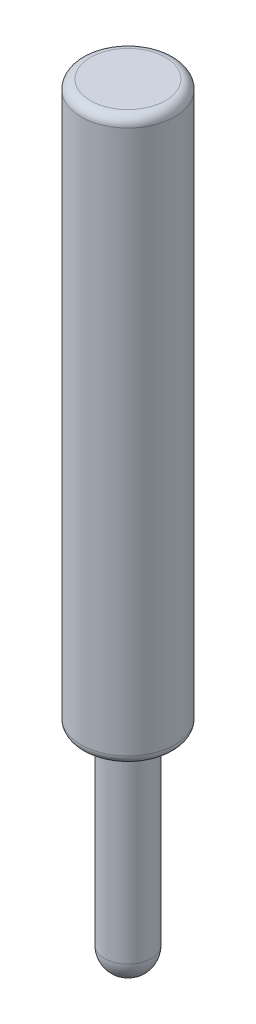
ISO-10303-21;
HEADER;
FILE_DESCRIPTION(('STEP AP214'),'2;1');
FILE_NAME('part.step','',(''),(''),'','','');
FILE_SCHEMA(('AUTOMOTIVE_DESIGN { 1 0 10303 214 1 1 1 1 }'));
ENDSEC;
DATA;
#1=APPLICATION_CONTEXT('core data for automotive mechanical design processes');
#2=APPLICATION_PROTOCOL_DEFINITION('international standard','automotive_design',2000,#1);
#3=PRODUCT_CONTEXT('',#1,'mechanical');
#4=PRODUCT('Part','Part','',(#3));
#5=PRODUCT_RELATED_PRODUCT_CATEGORY('part','',(#4));
#6=PRODUCT_DEFINITION_FORMATION('','',#4);
#7=PRODUCT_DEFINITION_CONTEXT('part definition',#1,'design');
#8=PRODUCT_DEFINITION('design','',#6,#7);
#9=PRODUCT_DEFINITION_SHAPE('','',#8);
#10=(LENGTH_UNIT() NAMED_UNIT(*) SI_UNIT(.MILLI.,.METRE.));
#11=(NAMED_UNIT(*) PLANE_ANGLE_UNIT() SI_UNIT($,.RADIAN.));
#12=(NAMED_UNIT(*) SI_UNIT($,.STERADIAN.) SOLID_ANGLE_UNIT());
#13=UNCERTAINTY_MEASURE_WITH_UNIT(LENGTH_MEASURE(1.E-05),#10,'distance_accuracy_value','');
#14=(GEOMETRIC_REPRESENTATION_CONTEXT(3) GLOBAL_UNCERTAINTY_ASSIGNED_CONTEXT((#13)) GLOBAL_UNIT_ASSIGNED_CONTEXT((#10,
#11,#12)) REPRESENTATION_CONTEXT('',''));
#15=CARTESIAN_POINT('',(0.,0.,0.));
#16=DIRECTION('',(0.,0.,1.));
#17=DIRECTION('',(1.,0.,0.));
#18=AXIS2_PLACEMENT_3D('',#15,#16,#17);
#19=CARTESIAN_POINT('',(0.,60.,0.));
#20=DIRECTION('',(0.,-1.,0.));
#21=DIRECTION('',(0.,0.,-1.));
#22=AXIS2_PLACEMENT_3D('',#19,#20,#21);
#23=CYLINDRICAL_SURFACE('',#22,5.);
#24=CARTESIAN_POINT('',(0.,1.,0.));
#25=DIRECTION('',(0.,1.,0.));
#26=DIRECTION('',(0.,0.,1.));
#27=AXIS2_PLACEMENT_3D('',#24,#25,#26);
#28=CIRCLE('',#27,5.);
#29=CARTESIAN_POINT('',(0.,1.,5.));
#30=VERTEX_POINT('',#29);
#31=EDGE_CURVE('E55',#30,#30,#28,.T.);
#32=ORIENTED_EDGE('',*,*,#31,.T.);
#33=EDGE_LOOP('',(#32));
#34=FACE_BOUND('',#33,.T.);
#35=CARTESIAN_POINT('',(0.,59.,0.));
#36=DIRECTION('',(0.,1.,0.));
#37=DIRECTION('',(0.,0.,1.));
#38=AXIS2_PLACEMENT_3D('',#35,#36,#37);
#39=CIRCLE('',#38,5.);
#40=CARTESIAN_POINT('',(0.,59.,5.));
#41=VERTEX_POINT('',#40);
#42=EDGE_CURVE('E59',#41,#41,#39,.F.);
#43=ORIENTED_EDGE('',*,*,#42,.T.);
#44=EDGE_LOOP('',(#43));
#45=FACE_BOUND('',#44,.T.);
#46=ADVANCED_FACE('F44',(#34,#45),#23,.T.);
#47=CARTESIAN_POINT('',(0.,60.,0.));
#48=DIRECTION('',(0.,1.,0.));
#49=DIRECTION('',(0.,0.,1.));
#50=AXIS2_PLACEMENT_3D('',#47,#48,#49);
#51=PLANE('',#50);
#52=CARTESIAN_POINT('',(0.,60.,0.));
#53=DIRECTION('',(0.,1.,0.));
#54=DIRECTION('',(0.,0.,1.));
#55=AXIS2_PLACEMENT_3D('',#52,#53,#54);
#56=CIRCLE('',#55,4.);
#57=CARTESIAN_POINT('',(0.,60.,4.));
#58=VERTEX_POINT('',#57);
#59=EDGE_CURVE('E12',#58,#58,#56,.T.);
#60=ORIENTED_EDGE('',*,*,#59,.T.);
#61=EDGE_LOOP('',(#60));
#62=FACE_BOUND('',#61,.T.);
#63=ADVANCED_FACE('F81',(#62),#51,.T.);
#64=CARTESIAN_POINT('',(0.,0.,0.));
#65=DIRECTION('',(0.,1.,0.));
#66=DIRECTION('',(0.,0.,1.));
#67=AXIS2_PLACEMENT_3D('',#64,#65,#66);
#68=PLANE('',#67);
#69=CARTESIAN_POINT('',(0.,0.,0.));
#70=DIRECTION('',(0.,1.,0.));
#71=DIRECTION('',(0.,0.,1.));
#72=AXIS2_PLACEMENT_3D('',#69,#70,#71);
#73=CIRCLE('',#72,4.);
#74=CARTESIAN_POINT('',(0.,0.,4.));
#75=VERTEX_POINT('',#74);
#76=EDGE_CURVE('E51',#75,#75,#73,.F.);
#77=ORIENTED_EDGE('',*,*,#76,.T.);
#78=EDGE_LOOP('',(#77));
#79=FACE_BOUND('',#78,.T.);
#80=CARTESIAN_POINT('',(0.,0.,0.));
#81=DIRECTION('',(0.,1.,0.));
#82=DIRECTION('',(0.,0.,1.));
#83=AXIS2_PLACEMENT_3D('',#80,#81,#82);
#84=CIRCLE('',#83,2.5);
#85=CARTESIAN_POINT('',(0.,0.,2.5));
#86=VERTEX_POINT('',#85);
#87=EDGE_CURVE('E64',#86,#86,#84,.T.);
#88=ORIENTED_EDGE('',*,*,#87,.T.);
#89=EDGE_LOOP('',(#88));
#90=FACE_BOUND('',#89,.T.);
#91=ADVANCED_FACE('F76',(#79,#90),#68,.F.);
#92=CARTESIAN_POINT('',(0.,-20.,0.));
#93=DIRECTION('',(0.,1.,0.));
#94=DIRECTION('',(0.,0.,1.));
#95=AXIS2_PLACEMENT_3D('',#92,#93,#94);
#96=CYLINDRICAL_SURFACE('',#95,2.5);
#97=CARTESIAN_POINT('',(0.,-20.,0.));
#98=DIRECTION('',(0.,1.,0.));
#99=DIRECTION('',(0.,0.,1.));
#100=AXIS2_PLACEMENT_3D('',#97,#98,#99);
#101=CIRCLE('',#100,2.5);
#102=CARTESIAN_POINT('',(0.,-20.,2.5));
#103=VERTEX_POINT('',#102);
#104=EDGE_CURVE('E67',#103,#103,#101,.F.);
#105=ORIENTED_EDGE('',*,*,#104,.F.);
#106=EDGE_LOOP('',(#105));
#107=FACE_BOUND('',#106,.T.);
#108=ORIENTED_EDGE('',*,*,#87,.F.);
#109=EDGE_LOOP('',(#108));
#110=FACE_BOUND('',#109,.T.);
#111=ADVANCED_FACE('F73',(#107,#110),#96,.T.);
#112=CARTESIAN_POINT('',(0.,-20.,0.));
#113=DIRECTION('',(0.,1.,0.));
#114=DIRECTION('',(1.,0.,0.));
#115=AXIS2_PLACEMENT_3D('',#112,#113,#114);
#116=SPHERICAL_SURFACE('',#115,2.5);
#117=ORIENTED_EDGE('',*,*,#104,.T.);
#118=EDGE_LOOP('',(#117));
#119=FACE_BOUND('',#118,.T.);
#120=ADVANCED_FACE('F71',(#119),#116,.T.);
#121=CARTESIAN_POINT('',(0.,1.,0.));
#122=DIRECTION('',(0.,1.,0.));
#123=DIRECTION('',(0.,0.,1.));
#124=AXIS2_PLACEMENT_3D('',#121,#122,#123);
#125=TOROIDAL_SURFACE('',#124,4.,1.);
#126=ORIENTED_EDGE('',*,*,#76,.F.);
#127=EDGE_LOOP('',(#126));
#128=FACE_BOUND('',#127,.T.);
#129=ORIENTED_EDGE('',*,*,#31,.F.);
#130=EDGE_LOOP('',(#129));
#131=FACE_BOUND('',#130,.T.);
#132=ADVANCED_FACE('F93',(#128,#131),#125,.T.);
#133=CARTESIAN_POINT('',(0.,59.,0.));
#134=DIRECTION('',(0.,1.,0.));
#135=DIRECTION('',(0.,0.,1.));
#136=AXIS2_PLACEMENT_3D('',#133,#134,#135);
#137=TOROIDAL_SURFACE('',#136,4.,1.);
#138=ORIENTED_EDGE('',*,*,#42,.F.);
#139=EDGE_LOOP('',(#138));
#140=FACE_BOUND('',#139,.T.);
#141=ORIENTED_EDGE('',*,*,#59,.F.);
#142=EDGE_LOOP('',(#141));
#143=FACE_BOUND('',#142,.T.);
#144=ADVANCED_FACE('F46',(#140,#143),#137,.T.);
#145=CLOSED_SHELL('',(#46,#63,#91,#111,#120,#132,#144));
#146=MANIFOLD_SOLID_BREP('B2',#145);
#147=ADVANCED_BREP_SHAPE_REPRESENTATION('',(#18,#146),#14);
#148=SHAPE_DEFINITION_REPRESENTATION(#9,#147);
ENDSEC;
END-ISO-10303-21;
